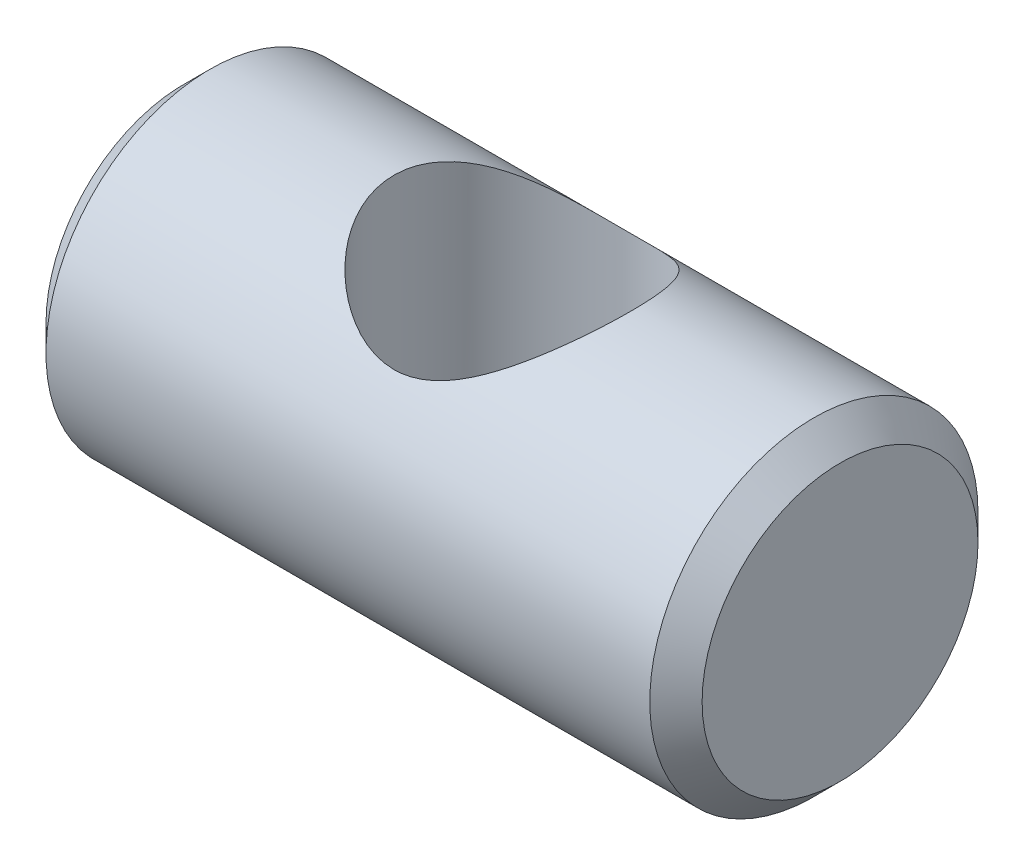
ISO-10303-21;
HEADER;
FILE_DESCRIPTION(('STEP AP214'),'2;1');
FILE_NAME('part.step','',(''),(''),'','','');
FILE_SCHEMA(('AUTOMOTIVE_DESIGN { 1 0 10303 214 1 1 1 1 }'));
ENDSEC;
DATA;
#1=APPLICATION_CONTEXT('core data for automotive mechanical design processes');
#2=APPLICATION_PROTOCOL_DEFINITION('international standard','automotive_design',2000,#1);
#3=PRODUCT_CONTEXT('',#1,'mechanical');
#4=PRODUCT('Part','Part','',(#3));
#5=PRODUCT_RELATED_PRODUCT_CATEGORY('part','',(#4));
#6=PRODUCT_DEFINITION_FORMATION('','',#4);
#7=PRODUCT_DEFINITION_CONTEXT('part definition',#1,'design');
#8=PRODUCT_DEFINITION('design','',#6,#7);
#9=PRODUCT_DEFINITION_SHAPE('','',#8);
#10=(LENGTH_UNIT() NAMED_UNIT(*) SI_UNIT(.MILLI.,.METRE.));
#11=(NAMED_UNIT(*) PLANE_ANGLE_UNIT() SI_UNIT($,.RADIAN.));
#12=(NAMED_UNIT(*) SI_UNIT($,.STERADIAN.) SOLID_ANGLE_UNIT());
#13=UNCERTAINTY_MEASURE_WITH_UNIT(LENGTH_MEASURE(1.E-05),#10,'distance_accuracy_value','');
#14=(GEOMETRIC_REPRESENTATION_CONTEXT(3) GLOBAL_UNCERTAINTY_ASSIGNED_CONTEXT((#13)) GLOBAL_UNIT_ASSIGNED_CONTEXT((#10,
#11,#12)) REPRESENTATION_CONTEXT('',''));
#15=CARTESIAN_POINT('',(0.,0.,0.));
#16=DIRECTION('',(0.,0.,1.));
#17=DIRECTION('',(1.,0.,0.));
#18=AXIS2_PLACEMENT_3D('',#15,#16,#17);
#19=CARTESIAN_POINT('',(19.05,0.,0.));
#20=DIRECTION('',(-1.,0.,0.));
#21=DIRECTION('',(0.,0.,1.));
#22=AXIS2_PLACEMENT_3D('',#19,#20,#21);
#23=CYLINDRICAL_SURFACE('',#22,4.765);
#24=CARTESIAN_POINT('',(6.09500000000002,-4.765,0.));
#25=CARTESIAN_POINT('',(6.09499959610919,-4.76500038568877,0.0847177312181432));
#26=CARTESIAN_POINT('',(6.09814294989109,-4.76273611404079,0.169430320303636));
#27=CARTESIAN_POINT('',(6.11066358139783,-4.75373529485614,0.33818363213569));
#28=CARTESIAN_POINT('',(6.12004307209303,-4.74699715971481,0.422224105655794));
#29=CARTESIAN_POINT('',(6.14488668170268,-4.72920873970222,0.588924625799263));
#30=CARTESIAN_POINT('',(6.16034991528612,-4.71815908226315,0.67158487145527));
#31=CARTESIAN_POINT('',(6.19712124740497,-4.69200787910789,0.834953469422152));
#32=CARTESIAN_POINT('',(6.21843186327193,-4.67690458834067,0.915660964741688));
#33=CARTESIAN_POINT('',(6.29045031365259,-4.62617094260924,1.15316852650018));
#34=CARTESIAN_POINT('',(6.34940304855711,-4.58500087201718,1.30638348551208));
#35=CARTESIAN_POINT('',(6.48662140964981,-4.49105510154723,1.59983536201371));
#36=CARTESIAN_POINT('',(6.56488973292429,-4.43827778103067,1.74007046332845));
#37=CARTESIAN_POINT('',(6.7460643265636,-4.31945657534803,2.01800830989138));
#38=CARTESIAN_POINT('',(6.85055522655824,-4.25264577187922,2.15434410715857));
#39=CARTESIAN_POINT('',(7.07720249701712,-4.11387476134022,2.40879453024458));
#40=CARTESIAN_POINT('',(7.19938539007363,-4.04190690648764,2.52688123888939));
#41=CARTESIAN_POINT('',(7.40679935127932,-3.92720984424589,2.69967192688624));
#42=CARTESIAN_POINT('',(7.48688627416953,-3.88447566291621,2.76064098743456));
#43=CARTESIAN_POINT('',(7.65252198947693,-3.80018618586981,2.87556982119529));
#44=CARTESIAN_POINT('',(7.73807228820807,-3.75863121987704,2.92952764877966));
#45=CARTESIAN_POINT('',(8.00254996269114,-3.6377926860457,3.08028310521369));
#46=CARTESIAN_POINT('',(8.18969989876755,-3.56210417233018,3.16629454903273));
#47=CARTESIAN_POINT('',(8.51939485136452,-3.45483234736675,3.28229960783894));
#48=CARTESIAN_POINT('',(8.65669069310712,-3.4169079996449,3.32141402000292));
#49=CARTESIAN_POINT('',(8.93822532565401,-3.35646405161201,3.38249013814496));
#50=CARTESIAN_POINT('',(9.08244840668605,-3.33391120752371,3.40448887468735));
#51=CARTESIAN_POINT('',(9.37532101808956,-3.30777812718485,3.42989942477073));
#52=CARTESIAN_POINT('',(9.52399395961725,-3.30432779253818,3.43318398182583));
#53=CARTESIAN_POINT('',(9.81967723971873,-3.31741991298231,3.42052722324128));
#54=CARTESIAN_POINT('',(9.96668617107891,-3.33397817475834,3.40457070727668));
#55=CARTESIAN_POINT('',(10.2721444513951,-3.38720452815873,3.35165699745504));
#56=CARTESIAN_POINT('',(10.4297818990276,-3.42609235464718,3.31236160200858));
#57=CARTESIAN_POINT('',(10.7342016018763,-3.51870609796138,3.21379149174679));
#58=CARTESIAN_POINT('',(10.8809584419369,-3.5724654481807,3.15447169211428));
#59=CARTESIAN_POINT('',(11.1144910062973,-3.66874066104023,3.04123108769056));
#60=CARTESIAN_POINT('',(11.2047445197354,-3.70889613431009,2.99228862221962));
#61=CARTESIAN_POINT('',(11.3798000082336,-3.79139086166971,2.8870476482067));
#62=CARTESIAN_POINT('',(11.4646024512642,-3.83372992773559,2.83074977238328));
#63=CARTESIAN_POINT('',(11.6286819133287,-3.91929841302884,2.71104159493219));
#64=CARTESIAN_POINT('',(11.7079534823531,-3.96252865756137,2.64762443422857));
#65=CARTESIAN_POINT('',(11.8606767388077,-4.04867094531033,2.51392387266249));
#66=CARTESIAN_POINT('',(11.9341281711495,-4.09158297450521,2.44364017115065));
#67=CARTESIAN_POINT('',(12.0756650372272,-4.17647896934048,2.29556362017696));
#68=CARTESIAN_POINT('',(12.143681799347,-4.21844733040164,2.21769602860418));
#69=CARTESIAN_POINT('',(12.272955350599,-4.29989137491217,2.05533634915456));
#70=CARTESIAN_POINT('',(12.3342132241495,-4.33936745779475,1.97084532769427));
#71=CARTESIAN_POINT('',(12.4492886648785,-4.41473694574765,1.79565917341629));
#72=CARTESIAN_POINT('',(12.5031195069431,-4.450636710244,1.70497555461375));
#73=CARTESIAN_POINT('',(12.6027495296725,-4.51791109785315,1.51776399509765));
#74=CARTESIAN_POINT('',(12.6485517365294,-4.54928742516665,1.42123827495272));
#75=CARTESIAN_POINT('',(12.7515745829349,-4.62050977119313,1.17456544061184));
#76=CARTESIAN_POINT('',(12.8035135239563,-4.65705260614719,1.02117281951566));
#77=CARTESIAN_POINT('',(12.8855010346838,-4.71513040060247,0.705988354234497));
#78=CARTESIAN_POINT('',(12.9155656190444,-4.73667633912987,0.544202747877958));
#79=CARTESIAN_POINT('',(12.9521791839077,-4.76295229392978,0.216031392103874));
#80=CARTESIAN_POINT('',(12.9586488497531,-4.76762559205244,0.0496320182090406));
#81=CARTESIAN_POINT('',(12.9474171737367,-4.75954299671493,-0.281922100999027));
#82=CARTESIAN_POINT('',(12.9297138780254,-4.7467856943759,-0.447076744618354));
#83=CARTESIAN_POINT('',(12.8727712937309,-4.70611618732336,-0.762721414921801));
#84=CARTESIAN_POINT('',(12.8346822723299,-4.67901421356729,-0.913529209504882));
#85=CARTESIAN_POINT('',(12.7396420868632,-4.61227785723414,-1.20609143238786));
#86=CARTESIAN_POINT('',(12.6826870564159,-4.57264090582636,-1.34784399780876));
#87=CARTESIAN_POINT('',(12.5463466735088,-4.47952673140869,-1.63197484348943));
#88=CARTESIAN_POINT('',(12.4654302950781,-4.42513949950625,-1.77331394441545));
#89=CARTESIAN_POINT('',(12.2864111819194,-4.30826168389104,-2.04094926429533));
#90=CARTESIAN_POINT('',(12.1882959109976,-4.24576519807202,-2.16723439689698));
#91=CARTESIAN_POINT('',(11.9576271688715,-4.10465299201109,-2.42536936475177));
#92=CARTESIAN_POINT('',(11.8220558438335,-4.02517333112418,-2.55405118470738));
#93=CARTESIAN_POINT('',(11.5315920206205,-3.866764636456,-2.78806591398091));
#94=CARTESIAN_POINT('',(11.3766870366769,-3.78783599362576,-2.89338361144201));
#95=CARTESIAN_POINT('',(11.0717646403691,-3.6492564097843,-3.06571333919893));
#96=CARTESIAN_POINT('',(10.924148945703,-3.58845735903786,-3.1360351201623));
#97=CARTESIAN_POINT('',(10.6162506817858,-3.48002124223204,-3.25595284611108));
#98=CARTESIAN_POINT('',(10.4559956729631,-3.43235650407537,-3.30559248021485));
#99=CARTESIAN_POINT('',(10.158089931823,-3.36518869683095,-3.37380690797711));
#100=CARTESIAN_POINT('',(10.0222632529116,-3.34197440203271,-3.39659121549822));
#101=CARTESIAN_POINT('',(9.74710649968959,-3.31225678048614,-3.42558639072587));
#102=CARTESIAN_POINT('',(9.6077810239035,-3.30573257074766,-3.43181796993377));
#103=CARTESIAN_POINT('',(9.32963848724307,-3.31045774857882,-3.42725818139827));
#104=CARTESIAN_POINT('',(9.19082181868192,-3.32171876848702,-3.41645567260397));
#105=CARTESIAN_POINT('',(8.91761315614652,-3.36018548165847,-3.37862015400287));
#106=CARTESIAN_POINT('',(8.78322844018555,-3.38741614463826,-3.35156172524388));
#107=CARTESIAN_POINT('',(8.47901089021318,-3.46500445620298,-3.27153835075048));
#108=CARTESIAN_POINT('',(8.31185103658576,-3.52000205613634,-3.21301195645724));
#109=CARTESIAN_POINT('',(7.99221338480471,-3.6425018189336,-3.07343681610102));
#110=CARTESIAN_POINT('',(7.83976074812907,-3.71002485349893,-2.99235036276751));
#111=CARTESIAN_POINT('',(7.54624351433185,-3.85212789013876,-2.80719769512117));
#112=CARTESIAN_POINT('',(7.40561832733594,-3.92685271703972,-2.7025506739677));
#113=CARTESIAN_POINT('',(7.14152022812123,-4.07546327279583,-2.47275982811188));
#114=CARTESIAN_POINT('',(7.01805331588238,-4.14934869987431,-2.34760886666907));
#115=CARTESIAN_POINT('',(6.83635821689446,-4.26219687307588,-2.13240779190859));
#116=CARTESIAN_POINT('',(6.77192267768827,-4.30321102404401,-2.04859844379145));
#117=CARTESIAN_POINT('',(6.6504516655069,-4.38191825181171,-1.87433788931678));
#118=CARTESIAN_POINT('',(6.59341288108394,-4.41961281231398,-1.78388968370403));
#119=CARTESIAN_POINT('',(6.48745606054911,-4.49059625248441,-1.59680172900397));
#120=CARTESIAN_POINT('',(6.43853230591874,-4.52388823119142,-1.5001664069973));
#121=CARTESIAN_POINT('',(6.34955220596911,-4.5850571293326,-1.301264375057));
#122=CARTESIAN_POINT('',(6.30949296081786,-4.61293581924006,-1.19899952041401));
#123=CARTESIAN_POINT('',(6.2450964516419,-4.65807487009905,-1.00771753586218));
#124=CARTESIAN_POINT('',(6.21924023703891,-4.67633675824679,-0.919445875934476));
#125=CARTESIAN_POINT('',(6.17457046904347,-4.70802022116129,-0.740296298593746));
#126=CARTESIAN_POINT('',(6.15575528330252,-4.72144291778977,-0.649418990524394));
#127=CARTESIAN_POINT('',(6.12552125844282,-4.74306537715817,-0.465920761812788));
#128=CARTESIAN_POINT('',(6.11409499638959,-4.75127038146896,-0.373301687543516));
#129=CARTESIAN_POINT('',(6.09883487265058,-4.76223727742007,-0.187119604642967));
#130=CARTESIAN_POINT('',(6.09500044603037,-4.76499957407079,-0.093556666768616));
#131=CARTESIAN_POINT('',(6.09500000000002,-4.765,0.));
#132=B_SPLINE_CURVE_WITH_KNOTS('',3,(#24,#25,#26,#27,#28,#29,#30,#31,#32,#33,#34,#35,#36,#37,
#38,#39,#40,#41,#42,#43,#44,#45,#46,#47,#48,#49,#50,#51,#52,#53,#54,#55,#56,#57,#58,#59,#60,#61,
#62,#63,#64,#65,#66,#67,#68,#69,#70,#71,#72,#73,#74,#75,#76,#77,#78,#79,#80,#81,#82,#83,#84,#85,
#86,#87,#88,#89,#90,#91,#92,#93,#94,#95,#96,#97,#98,#99,#100,#101,#102,#103,#104,#105,#106,#107,
#108,#109,#110,#111,#112,#113,#114,#115,#116,#117,#118,#119,#120,#121,#122,#123,#124,#125,#126,
#127,#128,#129,#130,#131),.UNSPECIFIED.,.T.,.F.,(4,2,2,2,2,2,2,2,2,2,2,2,2,2,2,2,2,2,2,2,2,2,2,
2,2,2,2,2,2,2,2,2,2,2,2,2,2,2,2,2,2,2,2,2,2,2,2,2,2,2,2,2,2,4),(0.,0.254056144534474,
0.508202492188904,0.762311869105355,1.01653081366771,1.52186449966476,2.0272687866938,
2.57821641184627,3.12999869834548,3.45770025357787,3.7854925531708,4.43939851343425,
4.88097136957113,5.32158618479439,5.76519363893576,6.20915176984628,6.70762640117556,
7.20723091465315,7.53759139604015,7.86792347822831,8.1985765954357,8.52924419668192,
8.86358500026263,9.19787208286409,9.53155370673103,9.86510928598013,10.360901375871,
10.856330120196,11.3534227282806,11.8505555176942,12.3222092140893,12.7939596306007,
13.3071563441909,13.8207286918533,14.4277422512297,15.0351498711535,15.5567378752995,
16.0772184174324,16.4944268013625,16.9111129093764,17.3280716616901,17.7456841045647,
18.2990144207386,18.853275196935,19.4230836966979,19.9930909508798,20.332859584608,
20.6724755785373,21.011851224868,21.3511156871554,21.6320471618883,21.9129134668015,
22.1934971724466,22.4740599981145),.UNSPECIFIED.);
#133=CARTESIAN_POINT('',(6.09500000000002,-4.765,0.));
#134=VERTEX_POINT('',#133);
#135=EDGE_CURVE('E10',#134,#134,#132,.T.);
#136=ORIENTED_EDGE('',*,*,#135,.T.);
#137=EDGE_LOOP('',(#136));
#138=FACE_BOUND('',#137,.T.);
#139=CARTESIAN_POINT('',(9.52500000000002,3.30761621111035,3.43));
#140=CARTESIAN_POINT('',(9.44359796146425,3.30761776842519,3.42999918864106));
#141=CARTESIAN_POINT('',(9.36218407056381,3.31063705514595,3.42709478577341));
#142=CARTESIAN_POINT('',(9.20016144139,3.32254520620497,3.41555039780778));
#143=CARTESIAN_POINT('',(9.11955323769195,3.33143773495609,3.40690683193314));
#144=CARTESIAN_POINT('',(8.95972677630651,3.35463714094608,3.38406531826882));
#145=CARTESIAN_POINT('',(8.88051232495892,3.36895698003822,3.36985407062161));
#146=CARTESIAN_POINT('',(8.72420699342421,3.40231588725374,3.33617036729262));
#147=CARTESIAN_POINT('',(8.64711738884878,3.42135772440774,3.31669482396565));
#148=CARTESIAN_POINT('',(8.42165336111231,3.48382518219671,3.25142621581383));
#149=CARTESIAN_POINT('',(8.27688018213992,3.53295223931879,3.19846108859091));
#150=CARTESIAN_POINT('',(7.99877939151398,3.64048939042037,3.07550378113376));
#151=CARTESIAN_POINT('',(7.86545060597325,3.69889853055096,3.00551335006843));
#152=CARTESIAN_POINT('',(7.58648070444628,3.83150331223241,2.83523058687006));
#153=CARTESIAN_POINT('',(7.44323542715552,3.90660269980671,2.73171543067713));
#154=CARTESIAN_POINT('',(7.17392980917619,4.05652006047322,2.5037001159196));
#155=CARTESIAN_POINT('',(7.04789275646875,4.13133752154036,2.37917201984086));
#156=CARTESIAN_POINT('',(6.86277920323917,4.24556805593846,2.16529760967855));
#157=CARTESIAN_POINT('',(6.79739511320831,4.28694907374565,2.08238514374896));
#158=CARTESIAN_POINT('',(6.67394608793832,4.36653195988115,1.9098781253717));
#159=CARTESIAN_POINT('',(6.61587782675788,4.40473527016354,1.82028663905997));
#160=CARTESIAN_POINT('',(6.50780139229153,4.47685118668652,1.63490106114947));
#161=CARTESIAN_POINT('',(6.45778201110923,4.51076974494608,1.53911585951493));
#162=CARTESIAN_POINT('',(6.36650662275987,4.57332525741562,1.34187667409253));
#163=CARTESIAN_POINT('',(6.32524649238828,4.60196469580302,1.24042538601124));
#164=CARTESIAN_POINT('',(6.23637581543262,4.66411353106844,0.987312568578566));
#165=CARTESIAN_POINT('',(6.19380454317669,4.69432595851433,0.832999309907671));
#166=CARTESIAN_POINT('',(6.13051974711707,4.73944390060314,0.517884205864162));
#167=CARTESIAN_POINT('',(6.10978809483452,4.75436211028707,0.357087857239514));
#168=CARTESIAN_POINT('',(6.09131818644795,4.76764635210463,0.0331106632530537));
#169=CARTESIAN_POINT('',(6.09363034381811,4.76597609329068,-0.130074629940496));
#170=CARTESIAN_POINT('',(6.12123458778608,4.74614098997373,-0.453473660086339));
#171=CARTESIAN_POINT('',(6.14653275434741,4.72797178138148,-0.613686599388157));
#172=CARTESIAN_POINT('',(6.21764552540146,4.67742620490943,-0.922349059984801));
#173=CARTESIAN_POINT('',(6.26288265392544,4.64545020844664,-1.07100011329414));
#174=CARTESIAN_POINT('',(6.37162441351807,4.56974645623048,-1.35820766764044));
#175=CARTESIAN_POINT('',(6.43513269106296,4.52601635475872,-1.49676214672241));
#176=CARTESIAN_POINT('',(6.58618148777766,4.42419680091417,-1.77658934822833));
#177=CARTESIAN_POINT('',(6.67560842239394,4.36505164034656,-1.91645292811232));
#178=CARTESIAN_POINT('',(6.87175812429219,4.23961424044081,-2.1799632079838));
#179=CARTESIAN_POINT('',(6.97849823576941,4.17331485658966,-2.30359341841757));
#180=CARTESIAN_POINT('',(7.22875272169333,4.02505079077683,-2.55524493897775));
#181=CARTESIAN_POINT('',(7.37541263307137,3.9424711733114,-2.67978228741706));
#182=CARTESIAN_POINT('',(7.68878036903881,3.78073783732062,-2.90349117675101));
#183=CARTESIAN_POINT('',(7.85548885435193,3.70158423182039,-3.00266188132186));
#184=CARTESIAN_POINT('',(8.16882893018811,3.57266844152221,-3.15418366724013));
#185=CARTESIAN_POINT('',(8.31170273924315,3.52028223872797,-3.21204111340728));
#186=CARTESIAN_POINT('',(8.60787948423819,3.42953641535839,-3.3087656279113));
#187=CARTESIAN_POINT('',(8.76115832282199,3.39114561413462,-3.34767497692611));
#188=CARTESIAN_POINT('',(9.05124602577449,3.33881503385712,-3.39981036860877));
#189=CARTESIAN_POINT('',(9.18698300968215,3.32203140316326,-3.41605679352166));
#190=CARTESIAN_POINT('',(9.46043061576793,3.30543988741879,-3.43211991719663));
#191=CARTESIAN_POINT('',(9.59813974562484,3.30561978122036,-3.4319484440158));
#192=CARTESIAN_POINT('',(9.87118187803283,3.32288915506671,-3.41522391835476));
#193=CARTESIAN_POINT('',(10.0065185824781,3.33994935122144,-3.39869923535787));
#194=CARTESIAN_POINT('',(10.27186074815,3.38836511388486,-3.35042547694232));
#195=CARTESIAN_POINT('',(10.4018578883026,3.4197421339738,-3.31865355000988));
#196=CARTESIAN_POINT('',(10.7064553675357,3.50813233030795,-3.22549691393665));
#197=CARTESIAN_POINT('',(10.8774349580402,3.57038174524695,-3.15730866715353));
#198=CARTESIAN_POINT('',(11.20303526365,3.70595313818717,-2.9970272592147));
#199=CARTESIAN_POINT('',(11.357622746024,3.77929690501084,-2.90488679526846));
#200=CARTESIAN_POINT('',(11.6536763340265,3.93129198316696,-2.69580359039099));
#201=CARTESIAN_POINT('',(11.7946581424325,4.01003416415893,-2.5782425092746));
#202=CARTESIAN_POINT('',(12.0569445891547,4.16411342053437,-2.32116677073248));
#203=CARTESIAN_POINT('',(12.178267053333,4.23945353546831,-2.18167222994526));
#204=CARTESIAN_POINT('',(12.3916016940623,4.37624244780666,-1.89150742529311));
#205=CARTESIAN_POINT('',(12.4849983293556,4.43827339699239,-1.742135506112));
#206=CARTESIAN_POINT('',(12.6492032541642,4.54942980885924,-1.42679036463322));
#207=CARTESIAN_POINT('',(12.7200193923573,4.5985597547059,-1.26082293711808));
#208=CARTESIAN_POINT('',(12.806774492904,4.6593942518596,-1.00164613231786));
#209=CARTESIAN_POINT('',(12.8325205426448,4.67758234033205,-0.913120057388833));
#210=CARTESIAN_POINT('',(12.8769322872855,4.70908970031716,-0.73347886885611));
#211=CARTESIAN_POINT('',(12.8956016283031,4.72241147895955,-0.642365114580646));
#212=CARTESIAN_POINT('',(12.9255123075814,4.74380655916189,-0.458369221699818));
#213=CARTESIAN_POINT('',(12.9367575626452,4.75188262821961,-0.365488042208054));
#214=CARTESIAN_POINT('',(12.9516150584392,4.76256113402722,-0.178809575019191));
#215=CARTESIAN_POINT('',(12.9552283965806,4.76516435773006,-0.0850124209810961));
#216=CARTESIAN_POINT('',(12.9547818053649,4.76484297924135,0.0897828195454044));
#217=CARTESIAN_POINT('',(12.9516988117277,4.7626221588484,0.170786319987316));
#218=CARTESIAN_POINT('',(12.9398388522843,4.75409668800219,0.332167355747924));
#219=CARTESIAN_POINT('',(12.9310600364174,4.74779071064953,0.412544679090379));
#220=CARTESIAN_POINT('',(12.8963446664959,4.72292339365472,0.651781033805039));
#221=CARTESIAN_POINT('',(12.8620284020266,4.6984119598312,0.808913944039926));
#222=CARTESIAN_POINT('',(12.7734535548455,4.6359263768828,1.11229121692376));
#223=CARTESIAN_POINT('',(12.719441439392,4.59811881071508,1.25864437324627));
#224=CARTESIAN_POINT('',(12.5937026333034,4.51167117995918,1.54003858984487));
#225=CARTESIAN_POINT('',(12.521973031034,4.46302933503015,1.6750777859319));
#226=CARTESIAN_POINT('',(12.3521445234142,4.35068587431454,1.94979264340275));
#227=CARTESIAN_POINT('',(12.2517838026686,4.28583519897226,2.0875903592959));
#228=CARTESIAN_POINT('',(12.0334263188984,4.15032061508074,2.34548702714922));
#229=CARTESIAN_POINT('',(11.9154039042247,4.07964831952234,2.4655597231043));
#230=CARTESIAN_POINT('',(11.7148360489843,3.96634971162313,2.64185348081618));
#231=CARTESIAN_POINT('',(11.6374009641132,3.92401508470718,2.70417268912592));
#232=CARTESIAN_POINT('',(11.4771427149644,3.84012139816795,2.82204524756536));
#233=CARTESIAN_POINT('',(11.3943181471876,3.79856254422233,2.87759682440142));
#234=CARTESIAN_POINT('',(11.1380830175248,3.67690814111049,3.03361744392612));
#235=CARTESIAN_POINT('',(10.9566328866015,3.59966945231082,3.12369786533345));
#236=CARTESIAN_POINT('',(10.6313974249465,3.48551924779467,3.24982741718261));
#237=CARTESIAN_POINT('',(10.4925859499066,3.44345626817472,3.29397865224323));
#238=CARTESIAN_POINT('',(10.2785973115811,3.39167249586216,3.34699608430657));
#239=CARTESIAN_POINT('',(10.2063926297669,3.37630760622148,3.36245672146341));
#240=CARTESIAN_POINT('',(10.0603864100883,3.34989869642638,3.38876900247123));
#241=CARTESIAN_POINT('',(9.98658568874914,3.33885251955991,3.39962294708016));
#242=CARTESIAN_POINT('',(9.84825972326986,3.32276717723329,3.41534045687266));
#243=CARTESIAN_POINT('',(9.78387728785286,3.31710485104418,3.42082860533395));
#244=CARTESIAN_POINT('',(9.65466582300344,3.30952821170844,3.42815922145793));
#245=CARTESIAN_POINT('',(9.58983667113831,3.30761497071009,3.43000064624687));
#246=CARTESIAN_POINT('',(9.52500000000002,3.30761621111035,3.43));
#247=B_SPLINE_CURVE_WITH_KNOTS('',3,(#139,#140,#141,#142,#143,#144,#145,#146,#147,#148,#149,
#150,#151,#152,#153,#154,#155,#156,#157,#158,#159,#160,#161,#162,#163,#164,#165,#166,#167,#168,
#169,#170,#171,#172,#173,#174,#175,#176,#177,#178,#179,#180,#181,#182,#183,#184,#185,#186,#187,
#188,#189,#190,#191,#192,#193,#194,#195,#196,#197,#198,#199,#200,#201,#202,#203,#204,#205,#206,
#207,#208,#209,#210,#211,#212,#213,#214,#215,#216,#217,#218,#219,#220,#221,#222,#223,#224,#225,
#226,#227,#228,#229,#230,#231,#232,#233,#234,#235,#236,#237,#238,#239,#240,#241,#242,#243,#244,
#245,#246),.UNSPECIFIED.,.T.,.F.,(4,2,2,2,2,2,2,2,2,2,2,2,2,2,2,2,2,2,2,2,2,2,2,2,2,2,2,2,2,2,2,
2,2,2,2,2,2,2,2,2,2,2,2,2,2,2,2,2,2,2,2,2,2,4),(0.,0.244121231467741,0.488394918274502,
0.733255709481724,0.978260430666176,1.46158753667942,1.94486500693025,2.51897543457968,
3.09385526676081,3.43367812430526,3.77334592889189,4.11253658189007,4.45156721334802,
4.93801025474995,5.42404919398381,5.91115168482385,6.39838305526931,6.87234588132182,
7.34640336450454,7.87314437808767,8.40041637306114,9.02605952943899,9.65172331025712,
10.1385037543623,10.6241929647026,11.0355129972519,11.4465367019663,11.8568486121367,
12.267777399063,12.8475544509856,13.4284853093657,14.0255674248294,14.6221050769229,
15.1802237793126,15.7381482751203,16.0197030121132,16.3011124864339,16.5823733757045,
16.8635938190611,17.1065597222475,17.3496045827585,17.8351925843091,18.3149016758906,
18.7946896538131,19.3398903171276,19.8858906502389,20.2096761541077,20.5335463164645,
21.180081609351,21.6331768971706,21.8592026936634,22.085115471036,22.2795022924366,
22.4739446956891),.UNSPECIFIED.);
#248=CARTESIAN_POINT('',(9.52500000000002,3.30761621111035,3.43));
#249=VERTEX_POINT('',#248);
#250=EDGE_CURVE('E47',#249,#249,#247,.T.);
#251=ORIENTED_EDGE('',*,*,#250,.T.);
#252=EDGE_LOOP('',(#251));
#253=FACE_BOUND('',#252,.T.);
#254=CARTESIAN_POINT('',(0.760000000000007,0.,0.));
#255=DIRECTION('',(1.,0.,0.));
#256=DIRECTION('',(0.,0.,-1.));
#257=AXIS2_PLACEMENT_3D('',#254,#255,#256);
#258=CIRCLE('',#257,4.765);
#259=CARTESIAN_POINT('',(0.760000000000007,0.,-4.765));
#260=VERTEX_POINT('',#259);
#261=EDGE_CURVE('E88',#260,#260,#258,.T.);
#262=ORIENTED_EDGE('',*,*,#261,.T.);
#263=EDGE_LOOP('',(#262));
#264=FACE_BOUND('',#263,.T.);
#265=CARTESIAN_POINT('',(18.29,0.,0.));
#266=DIRECTION('',(1.,0.,0.));
#267=DIRECTION('',(0.,0.,-1.));
#268=AXIS2_PLACEMENT_3D('',#265,#266,#267);
#269=CIRCLE('',#268,4.765);
#270=CARTESIAN_POINT('',(18.29,0.,-4.765));
#271=VERTEX_POINT('',#270);
#272=EDGE_CURVE('E91',#271,#271,#269,.F.);
#273=ORIENTED_EDGE('',*,*,#272,.T.);
#274=EDGE_LOOP('',(#273));
#275=FACE_BOUND('',#274,.T.);
#276=ADVANCED_FACE('F34',(#138,#253,#264,#275),#23,.T.);
#277=CARTESIAN_POINT('',(19.05,0.,0.));
#278=DIRECTION('',(1.,0.,0.));
#279=DIRECTION('',(0.,0.,-1.));
#280=AXIS2_PLACEMENT_3D('',#277,#278,#279);
#281=PLANE('',#280);
#282=CARTESIAN_POINT('',(19.05,0.,0.));
#283=DIRECTION('',(1.,0.,0.));
#284=DIRECTION('',(0.,0.,-1.));
#285=AXIS2_PLACEMENT_3D('',#282,#283,#284);
#286=CIRCLE('',#285,4.00500000000001);
#287=CARTESIAN_POINT('',(19.05,0.,-4.00500000000001));
#288=VERTEX_POINT('',#287);
#289=EDGE_CURVE('E51',#288,#288,#286,.T.);
#290=ORIENTED_EDGE('',*,*,#289,.T.);
#291=EDGE_LOOP('',(#290));
#292=FACE_BOUND('',#291,.T.);
#293=ADVANCED_FACE('F68',(#292),#281,.T.);
#294=CARTESIAN_POINT('',(0.,0.,0.));
#295=DIRECTION('',(1.,0.,0.));
#296=DIRECTION('',(0.,0.,-1.));
#297=AXIS2_PLACEMENT_3D('',#294,#295,#296);
#298=PLANE('',#297);
#299=CARTESIAN_POINT('',(0.,0.,0.));
#300=DIRECTION('',(1.,0.,0.));
#301=DIRECTION('',(0.,0.,-1.));
#302=AXIS2_PLACEMENT_3D('',#299,#300,#301);
#303=CIRCLE('',#302,4.00499999999999);
#304=CARTESIAN_POINT('',(0.,0.,-4.00499999999999));
#305=VERTEX_POINT('',#304);
#306=EDGE_CURVE('E55',#305,#305,#303,.F.);
#307=ORIENTED_EDGE('',*,*,#306,.T.);
#308=EDGE_LOOP('',(#307));
#309=FACE_BOUND('',#308,.T.);
#310=ADVANCED_FACE('F71',(#309),#298,.F.);
#311=CARTESIAN_POINT('',(0.760000000000007,0.,0.));
#312=DIRECTION('',(1.,0.,0.));
#313=DIRECTION('',(0.,0.,-1.));
#314=AXIS2_PLACEMENT_3D('',#311,#312,#313);
#315=CONICAL_SURFACE('',#314,4.765,0.785398163397449);
#316=ORIENTED_EDGE('',*,*,#306,.F.);
#317=EDGE_LOOP('',(#316));
#318=FACE_BOUND('',#317,.T.);
#319=ORIENTED_EDGE('',*,*,#261,.F.);
#320=EDGE_LOOP('',(#319));
#321=FACE_BOUND('',#320,.T.);
#322=ADVANCED_FACE('F74',(#318,#321),#315,.T.);
#323=CARTESIAN_POINT('',(19.05,0.,0.));
#324=DIRECTION('',(-1.,0.,0.));
#325=DIRECTION('',(0.,0.,1.));
#326=AXIS2_PLACEMENT_3D('',#323,#324,#325);
#327=CONICAL_SURFACE('',#326,4.00500000000001,0.785398163397449);
#328=ORIENTED_EDGE('',*,*,#272,.F.);
#329=EDGE_LOOP('',(#328));
#330=FACE_BOUND('',#329,.T.);
#331=ORIENTED_EDGE('',*,*,#289,.F.);
#332=EDGE_LOOP('',(#331));
#333=FACE_BOUND('',#332,.T.);
#334=ADVANCED_FACE('F37',(#330,#333),#327,.T.);
#335=CARTESIAN_POINT('',(9.52500000000002,-4.765,0.));
#336=DIRECTION('',(0.,1.,0.));
#337=DIRECTION('',(0.,0.,1.));
#338=AXIS2_PLACEMENT_3D('',#335,#336,#337);
#339=CYLINDRICAL_SURFACE('',#338,3.43);
#340=ORIENTED_EDGE('',*,*,#250,.F.);
#341=EDGE_LOOP('',(#340));
#342=FACE_BOUND('',#341,.T.);
#343=ORIENTED_EDGE('',*,*,#135,.F.);
#344=EDGE_LOOP('',(#343));
#345=FACE_BOUND('',#344,.T.);
#346=ADVANCED_FACE('F63',(#342,#345),#339,.F.);
#347=CLOSED_SHELL('',(#276,#293,#310,#322,#334,#346));
#348=MANIFOLD_SOLID_BREP('B2',#347);
#349=ADVANCED_BREP_SHAPE_REPRESENTATION('',(#18,#348),#14);
#350=SHAPE_DEFINITION_REPRESENTATION(#9,#349);
ENDSEC;
END-ISO-10303-21;
